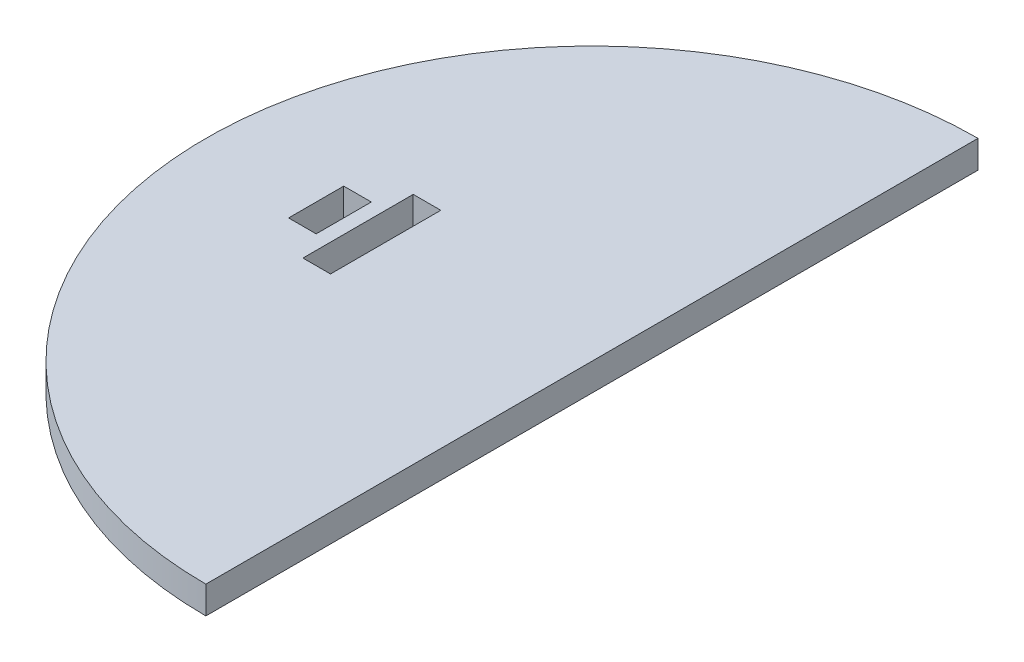
ISO-10303-21;
HEADER;
FILE_DESCRIPTION(('STEP AP214'),'2;1');
FILE_NAME('part.step','',(''),(''),'','','');
FILE_SCHEMA(('AUTOMOTIVE_DESIGN { 1 0 10303 214 1 1 1 1 }'));
ENDSEC;
DATA;
#1=APPLICATION_CONTEXT('core data for automotive mechanical design processes');
#2=APPLICATION_PROTOCOL_DEFINITION('international standard','automotive_design',2000,#1);
#3=PRODUCT_CONTEXT('',#1,'mechanical');
#4=PRODUCT('Part','Part','',(#3));
#5=PRODUCT_RELATED_PRODUCT_CATEGORY('part','',(#4));
#6=PRODUCT_DEFINITION_FORMATION('','',#4);
#7=PRODUCT_DEFINITION_CONTEXT('part definition',#1,'design');
#8=PRODUCT_DEFINITION('design','',#6,#7);
#9=PRODUCT_DEFINITION_SHAPE('','',#8);
#10=(LENGTH_UNIT() NAMED_UNIT(*) SI_UNIT(.MILLI.,.METRE.));
#11=(NAMED_UNIT(*) PLANE_ANGLE_UNIT() SI_UNIT($,.RADIAN.));
#12=(NAMED_UNIT(*) SI_UNIT($,.STERADIAN.) SOLID_ANGLE_UNIT());
#13=UNCERTAINTY_MEASURE_WITH_UNIT(LENGTH_MEASURE(1.E-05),#10,'distance_accuracy_value','');
#14=(GEOMETRIC_REPRESENTATION_CONTEXT(3) GLOBAL_UNCERTAINTY_ASSIGNED_CONTEXT((#13)) GLOBAL_UNIT_ASSIGNED_CONTEXT((#10,
#11,#12)) REPRESENTATION_CONTEXT('',''));
#15=CARTESIAN_POINT('',(0.,0.,0.));
#16=DIRECTION('',(0.,0.,1.));
#17=DIRECTION('',(1.,0.,0.));
#18=AXIS2_PLACEMENT_3D('',#15,#16,#17);
#19=CARTESIAN_POINT('',(0.,5.,0.));
#20=DIRECTION('',(0.,1.,0.));
#21=DIRECTION('',(0.,0.,1.));
#22=AXIS2_PLACEMENT_3D('',#19,#20,#21);
#23=PLANE('',#22);
#24=DIRECTION('',(1.,0.,0.));
#25=VECTOR('',#24,1.);
#26=CARTESIAN_POINT('',(-50.0000000000005,5.,-5.));
#27=LINE('',#26,#25);
#28=CARTESIAN_POINT('',(-50.0000000000005,5.,-5.));
#29=VERTEX_POINT('',#28);
#30=CARTESIAN_POINT('',(-45.0000000000005,5.,-5.));
#31=VERTEX_POINT('',#30);
#32=EDGE_CURVE('E154',#29,#31,#27,.T.);
#33=ORIENTED_EDGE('',*,*,#32,.T.);
#34=DIRECTION('',(0.,0.,-1.));
#35=VECTOR('',#34,1.);
#36=CARTESIAN_POINT('',(-45.0000000000005,5.,5.));
#37=LINE('',#36,#35);
#38=CARTESIAN_POINT('',(-45.0000000000005,5.,5.));
#39=VERTEX_POINT('',#38);
#40=EDGE_CURVE('E157',#39,#31,#37,.T.);
#41=ORIENTED_EDGE('',*,*,#40,.F.);
#42=DIRECTION('',(1.,0.,0.));
#43=VECTOR('',#42,1.);
#44=CARTESIAN_POINT('',(-50.0000000000005,5.,5.));
#45=LINE('',#44,#43);
#46=CARTESIAN_POINT('',(-50.0000000000005,5.,5.));
#47=VERTEX_POINT('',#46);
#48=EDGE_CURVE('E160',#47,#39,#45,.T.);
#49=ORIENTED_EDGE('',*,*,#48,.F.);
#50=DIRECTION('',(0.,0.,-1.));
#51=VECTOR('',#50,1.);
#52=CARTESIAN_POINT('',(-50.0000000000005,5.,5.));
#53=LINE('',#52,#51);
#54=EDGE_CURVE('E163',#47,#29,#53,.T.);
#55=ORIENTED_EDGE('',*,*,#54,.T.);
#56=EDGE_LOOP('',(#33,#41,#49,#55));
#57=FACE_BOUND('',#56,.T.);
#58=DIRECTION('',(0.,0.,1.));
#59=VECTOR('',#58,1.);
#60=CARTESIAN_POINT('',(-5.11743425413158E-13,5.,-70.));
#61=LINE('',#60,#59);
#62=CARTESIAN_POINT('',(-4.88807387438039E-13,5.,-70.));
#63=VERTEX_POINT('',#62);
#64=CARTESIAN_POINT('',(0.,5.,70.));
#65=VERTEX_POINT('',#64);
#66=EDGE_CURVE('E185',#63,#65,#61,.T.);
#67=ORIENTED_EDGE('',*,*,#66,.F.);
#68=CARTESIAN_POINT('',(0.,5.,0.));
#69=DIRECTION('',(0.,1.,0.));
#70=DIRECTION('',(0.,0.,1.));
#71=AXIS2_PLACEMENT_3D('',#68,#69,#70);
#72=CIRCLE('',#71,70.);
#73=EDGE_CURVE('E188',#63,#65,#72,.T.);
#74=ORIENTED_EDGE('',*,*,#73,.T.);
#75=EDGE_LOOP('',(#67,#74));
#76=FACE_BOUND('',#75,.T.);
#77=DIRECTION('',(1.,0.,0.));
#78=VECTOR('',#77,1.);
#79=CARTESIAN_POINT('',(-42.4,5.,-9.99999999999999));
#80=LINE('',#79,#78);
#81=CARTESIAN_POINT('',(-42.4,5.,-9.99999999999999));
#82=VERTEX_POINT('',#81);
#83=CARTESIAN_POINT('',(-37.4,5.,-9.99999999999999));
#84=VERTEX_POINT('',#83);
#85=EDGE_CURVE('E145',#82,#84,#80,.T.);
#86=ORIENTED_EDGE('',*,*,#85,.T.);
#87=DIRECTION('',(0.,0.,1.));
#88=VECTOR('',#87,1.);
#89=CARTESIAN_POINT('',(-37.4,5.,0.));
#90=LINE('',#89,#88);
#91=CARTESIAN_POINT('',(-37.4,5.,10.));
#92=VERTEX_POINT('',#91);
#93=EDGE_CURVE('E66',#84,#92,#90,.T.);
#94=ORIENTED_EDGE('',*,*,#93,.T.);
#95=DIRECTION('',(-1.,0.,0.));
#96=VECTOR('',#95,1.);
#97=CARTESIAN_POINT('',(-37.4,5.,10.));
#98=LINE('',#97,#96);
#99=CARTESIAN_POINT('',(-42.4,5.,10.));
#100=VERTEX_POINT('',#99);
#101=EDGE_CURVE('E136',#92,#100,#98,.T.);
#102=ORIENTED_EDGE('',*,*,#101,.T.);
#103=DIRECTION('',(0.,0.,-1.));
#104=VECTOR('',#103,1.);
#105=CARTESIAN_POINT('',(-42.4,5.,10.));
#106=LINE('',#105,#104);
#107=EDGE_CURVE('E142',#100,#82,#106,.T.);
#108=ORIENTED_EDGE('',*,*,#107,.T.);
#109=EDGE_LOOP('',(#86,#94,#102,#108));
#110=FACE_BOUND('',#109,.T.);
#111=ADVANCED_FACE('F51',(#57,#76,#110),#23,.T.);
#112=CARTESIAN_POINT('',(0.,0.,0.));
#113=DIRECTION('',(0.,1.,0.));
#114=DIRECTION('',(0.,0.,1.));
#115=AXIS2_PLACEMENT_3D('',#112,#113,#114);
#116=PLANE('',#115);
#117=DIRECTION('',(0.,0.,1.));
#118=VECTOR('',#117,1.);
#119=CARTESIAN_POINT('',(-5.11743425413158E-13,0.,-70.));
#120=LINE('',#119,#118);
#121=CARTESIAN_POINT('',(-4.88807387438039E-13,0.,-70.));
#122=VERTEX_POINT('',#121);
#123=CARTESIAN_POINT('',(0.,0.,70.));
#124=VERTEX_POINT('',#123);
#125=EDGE_CURVE('E178',#122,#124,#120,.T.);
#126=ORIENTED_EDGE('',*,*,#125,.T.);
#127=CARTESIAN_POINT('',(0.,0.,0.));
#128=DIRECTION('',(0.,1.,0.));
#129=DIRECTION('',(0.,0.,1.));
#130=AXIS2_PLACEMENT_3D('',#127,#128,#129);
#131=CIRCLE('',#130,70.);
#132=EDGE_CURVE('E189',#122,#124,#131,.T.);
#133=ORIENTED_EDGE('',*,*,#132,.F.);
#134=EDGE_LOOP('',(#126,#133));
#135=FACE_BOUND('',#134,.T.);
#136=DIRECTION('',(0.,0.,-1.));
#137=VECTOR('',#136,1.);
#138=CARTESIAN_POINT('',(-45.0000000000005,0.,5.));
#139=LINE('',#138,#137);
#140=CARTESIAN_POINT('',(-45.0000000000005,0.,5.));
#141=VERTEX_POINT('',#140);
#142=CARTESIAN_POINT('',(-45.0000000000005,0.,-5.));
#143=VERTEX_POINT('',#142);
#144=EDGE_CURVE('E168',#141,#143,#139,.T.);
#145=ORIENTED_EDGE('',*,*,#144,.T.);
#146=DIRECTION('',(1.,0.,0.));
#147=VECTOR('',#146,1.);
#148=CARTESIAN_POINT('',(-50.0000000000005,0.,-5.));
#149=LINE('',#148,#147);
#150=CARTESIAN_POINT('',(-50.0000000000005,0.,-5.));
#151=VERTEX_POINT('',#150);
#152=EDGE_CURVE('E132',#151,#143,#149,.T.);
#153=ORIENTED_EDGE('',*,*,#152,.F.);
#154=DIRECTION('',(0.,0.,-1.));
#155=VECTOR('',#154,1.);
#156=CARTESIAN_POINT('',(-50.0000000000005,0.,5.));
#157=LINE('',#156,#155);
#158=CARTESIAN_POINT('',(-50.0000000000005,0.,5.));
#159=VERTEX_POINT('',#158);
#160=EDGE_CURVE('E158',#159,#151,#157,.T.);
#161=ORIENTED_EDGE('',*,*,#160,.F.);
#162=DIRECTION('',(1.,0.,0.));
#163=VECTOR('',#162,1.);
#164=CARTESIAN_POINT('',(-50.0000000000005,0.,5.));
#165=LINE('',#164,#163);
#166=EDGE_CURVE('E171',#159,#141,#165,.T.);
#167=ORIENTED_EDGE('',*,*,#166,.T.);
#168=EDGE_LOOP('',(#145,#153,#161,#167));
#169=FACE_BOUND('',#168,.T.);
#170=DIRECTION('',(0.,0.,1.));
#171=VECTOR('',#170,1.);
#172=CARTESIAN_POINT('',(-37.4,0.,0.));
#173=LINE('',#172,#171);
#174=CARTESIAN_POINT('',(-37.4,0.,-9.99999999999999));
#175=VERTEX_POINT('',#174);
#176=CARTESIAN_POINT('',(-37.4,0.,10.));
#177=VERTEX_POINT('',#176);
#178=EDGE_CURVE('E12',#175,#177,#173,.T.);
#179=ORIENTED_EDGE('',*,*,#178,.F.);
#180=DIRECTION('',(1.,0.,0.));
#181=VECTOR('',#180,1.);
#182=CARTESIAN_POINT('',(0.,0.,-9.99999999999999));
#183=LINE('',#182,#181);
#184=CARTESIAN_POINT('',(-42.4,0.,-9.99999999999999));
#185=VERTEX_POINT('',#184);
#186=EDGE_CURVE('E198',#185,#175,#183,.T.);
#187=ORIENTED_EDGE('',*,*,#186,.F.);
#188=DIRECTION('',(0.,0.,-1.));
#189=VECTOR('',#188,1.);
#190=CARTESIAN_POINT('',(-42.4,0.,0.));
#191=LINE('',#190,#189);
#192=CARTESIAN_POINT('',(-42.4,0.,10.));
#193=VERTEX_POINT('',#192);
#194=EDGE_CURVE('E201',#193,#185,#191,.T.);
#195=ORIENTED_EDGE('',*,*,#194,.F.);
#196=DIRECTION('',(-1.,0.,0.));
#197=VECTOR('',#196,1.);
#198=CARTESIAN_POINT('',(0.,0.,9.99999999999998));
#199=LINE('',#198,#197);
#200=EDGE_CURVE('E59',#177,#193,#199,.T.);
#201=ORIENTED_EDGE('',*,*,#200,.F.);
#202=EDGE_LOOP('',(#179,#187,#195,#201));
#203=FACE_BOUND('',#202,.T.);
#204=ADVANCED_FACE('F207',(#135,#169,#203),#116,.F.);
#205=CARTESIAN_POINT('',(-5.11743425413158E-13,5.,-70.));
#206=DIRECTION('',(1.,0.,0.));
#207=DIRECTION('',(0.,0.,-1.));
#208=AXIS2_PLACEMENT_3D('',#205,#206,#207);
#209=PLANE('',#208);
#210=ORIENTED_EDGE('',*,*,#125,.F.);
#211=DIRECTION('',(0.,-1.,0.));
#212=VECTOR('',#211,1.);
#213=CARTESIAN_POINT('',(-4.88807387438039E-13,5.,-70.));
#214=LINE('',#213,#212);
#215=EDGE_CURVE('E196',#63,#122,#214,.T.);
#216=ORIENTED_EDGE('',*,*,#215,.F.);
#217=ORIENTED_EDGE('',*,*,#66,.T.);
#218=DIRECTION('',(0.,-1.,0.));
#219=VECTOR('',#218,1.);
#220=CARTESIAN_POINT('',(0.,5.,70.));
#221=LINE('',#220,#219);
#222=EDGE_CURVE('E191',#65,#124,#221,.T.);
#223=ORIENTED_EDGE('',*,*,#222,.T.);
#224=EDGE_LOOP('',(#210,#216,#217,#223));
#225=FACE_BOUND('',#224,.T.);
#226=ADVANCED_FACE('F53',(#225),#209,.T.);
#227=CARTESIAN_POINT('',(0.,5.,0.));
#228=DIRECTION('',(0.,-1.,0.));
#229=DIRECTION('',(0.,0.,-1.));
#230=AXIS2_PLACEMENT_3D('',#227,#228,#229);
#231=CYLINDRICAL_SURFACE('',#230,70.);
#232=ORIENTED_EDGE('',*,*,#132,.T.);
#233=ORIENTED_EDGE('',*,*,#222,.F.);
#234=ORIENTED_EDGE('',*,*,#73,.F.);
#235=ORIENTED_EDGE('',*,*,#215,.T.);
#236=EDGE_LOOP('',(#232,#233,#234,#235));
#237=FACE_BOUND('',#236,.T.);
#238=ADVANCED_FACE('F227',(#237),#231,.T.);
#239=CARTESIAN_POINT('',(-50.0000000000005,5.,-5.));
#240=DIRECTION('',(0.,0.,-1.));
#241=DIRECTION('',(-1.,0.,0.));
#242=AXIS2_PLACEMENT_3D('',#239,#240,#241);
#243=PLANE('',#242);
#244=ORIENTED_EDGE('',*,*,#152,.T.);
#245=DIRECTION('',(0.,-1.,0.));
#246=VECTOR('',#245,1.);
#247=CARTESIAN_POINT('',(-45.0000000000005,5.,-5.));
#248=LINE('',#247,#246);
#249=EDGE_CURVE('E166',#31,#143,#248,.T.);
#250=ORIENTED_EDGE('',*,*,#249,.F.);
#251=ORIENTED_EDGE('',*,*,#32,.F.);
#252=DIRECTION('',(0.,-1.,0.));
#253=VECTOR('',#252,1.);
#254=CARTESIAN_POINT('',(-50.0000000000005,5.,-5.));
#255=LINE('',#254,#253);
#256=EDGE_CURVE('E176',#29,#151,#255,.T.);
#257=ORIENTED_EDGE('',*,*,#256,.T.);
#258=EDGE_LOOP('',(#244,#250,#251,#257));
#259=FACE_BOUND('',#258,.T.);
#260=ADVANCED_FACE('F225',(#259),#243,.F.);
#261=CARTESIAN_POINT('',(-50.0000000000005,5.,5.));
#262=DIRECTION('',(-1.,0.,0.));
#263=DIRECTION('',(0.,0.,1.));
#264=AXIS2_PLACEMENT_3D('',#261,#262,#263);
#265=PLANE('',#264);
#266=ORIENTED_EDGE('',*,*,#160,.T.);
#267=ORIENTED_EDGE('',*,*,#256,.F.);
#268=ORIENTED_EDGE('',*,*,#54,.F.);
#269=DIRECTION('',(0.,-1.,0.));
#270=VECTOR('',#269,1.);
#271=CARTESIAN_POINT('',(-50.0000000000005,5.,5.));
#272=LINE('',#271,#270);
#273=EDGE_CURVE('E179',#47,#159,#272,.T.);
#274=ORIENTED_EDGE('',*,*,#273,.T.);
#275=EDGE_LOOP('',(#266,#267,#268,#274));
#276=FACE_BOUND('',#275,.T.);
#277=ADVANCED_FACE('F234',(#276),#265,.F.);
#278=CARTESIAN_POINT('',(-50.0000000000005,5.,5.));
#279=DIRECTION('',(0.,0.,-1.));
#280=DIRECTION('',(-1.,0.,0.));
#281=AXIS2_PLACEMENT_3D('',#278,#279,#280);
#282=PLANE('',#281);
#283=ORIENTED_EDGE('',*,*,#166,.F.);
#284=ORIENTED_EDGE('',*,*,#273,.F.);
#285=ORIENTED_EDGE('',*,*,#48,.T.);
#286=DIRECTION('',(0.,-1.,0.));
#287=VECTOR('',#286,1.);
#288=CARTESIAN_POINT('',(-45.0000000000005,5.,5.));
#289=LINE('',#288,#287);
#290=EDGE_CURVE('E181',#39,#141,#289,.T.);
#291=ORIENTED_EDGE('',*,*,#290,.T.);
#292=EDGE_LOOP('',(#283,#284,#285,#291));
#293=FACE_BOUND('',#292,.T.);
#294=ADVANCED_FACE('F256',(#293),#282,.T.);
#295=CARTESIAN_POINT('',(-45.0000000000005,5.,5.));
#296=DIRECTION('',(-1.,0.,0.));
#297=DIRECTION('',(0.,0.,1.));
#298=AXIS2_PLACEMENT_3D('',#295,#296,#297);
#299=PLANE('',#298);
#300=ORIENTED_EDGE('',*,*,#144,.F.);
#301=ORIENTED_EDGE('',*,*,#290,.F.);
#302=ORIENTED_EDGE('',*,*,#40,.T.);
#303=ORIENTED_EDGE('',*,*,#249,.T.);
#304=EDGE_LOOP('',(#300,#301,#302,#303));
#305=FACE_BOUND('',#304,.T.);
#306=ADVANCED_FACE('F248',(#305),#299,.T.);
#307=CARTESIAN_POINT('',(-37.4,-5.,0.));
#308=DIRECTION('',(-1.,0.,0.));
#309=DIRECTION('',(0.,0.,1.));
#310=AXIS2_PLACEMENT_3D('',#307,#308,#309);
#311=PLANE('',#310);
#312=ORIENTED_EDGE('',*,*,#178,.T.);
#313=DIRECTION('',(0.,1.,0.));
#314=VECTOR('',#313,1.);
#315=CARTESIAN_POINT('',(-37.4,-5.,10.));
#316=LINE('',#315,#314);
#317=EDGE_CURVE('E126',#177,#92,#316,.T.);
#318=ORIENTED_EDGE('',*,*,#317,.T.);
#319=ORIENTED_EDGE('',*,*,#93,.F.);
#320=DIRECTION('',(0.,1.,0.));
#321=VECTOR('',#320,1.);
#322=CARTESIAN_POINT('',(-37.4,-5.,-9.99999999999999));
#323=LINE('',#322,#321);
#324=EDGE_CURVE('E150',#175,#84,#323,.T.);
#325=ORIENTED_EDGE('',*,*,#324,.F.);
#326=EDGE_LOOP('',(#312,#318,#319,#325));
#327=FACE_BOUND('',#326,.T.);
#328=ADVANCED_FACE('F128',(#327),#311,.T.);
#329=CARTESIAN_POINT('',(-37.4,-5.,10.));
#330=DIRECTION('',(0.,0.,-1.));
#331=DIRECTION('',(-1.,0.,0.));
#332=AXIS2_PLACEMENT_3D('',#329,#330,#331);
#333=PLANE('',#332);
#334=ORIENTED_EDGE('',*,*,#200,.T.);
#335=DIRECTION('',(0.,1.,0.));
#336=VECTOR('',#335,1.);
#337=CARTESIAN_POINT('',(-42.4,-5.,10.));
#338=LINE('',#337,#336);
#339=EDGE_CURVE('E133',#193,#100,#338,.T.);
#340=ORIENTED_EDGE('',*,*,#339,.T.);
#341=ORIENTED_EDGE('',*,*,#101,.F.);
#342=ORIENTED_EDGE('',*,*,#317,.F.);
#343=EDGE_LOOP('',(#334,#340,#341,#342));
#344=FACE_BOUND('',#343,.T.);
#345=ADVANCED_FACE('F137',(#344),#333,.T.);
#346=CARTESIAN_POINT('',(-42.4,-5.,10.));
#347=DIRECTION('',(1.,0.,0.));
#348=DIRECTION('',(0.,0.,-1.));
#349=AXIS2_PLACEMENT_3D('',#346,#347,#348);
#350=PLANE('',#349);
#351=ORIENTED_EDGE('',*,*,#194,.T.);
#352=DIRECTION('',(0.,1.,0.));
#353=VECTOR('',#352,1.);
#354=CARTESIAN_POINT('',(-42.4,-5.,-9.99999999999999));
#355=LINE('',#354,#353);
#356=EDGE_CURVE('E74',#185,#82,#355,.T.);
#357=ORIENTED_EDGE('',*,*,#356,.T.);
#358=ORIENTED_EDGE('',*,*,#107,.F.);
#359=ORIENTED_EDGE('',*,*,#339,.F.);
#360=EDGE_LOOP('',(#351,#357,#358,#359));
#361=FACE_BOUND('',#360,.T.);
#362=ADVANCED_FACE('F205',(#361),#350,.T.);
#363=CARTESIAN_POINT('',(-42.4,-5.,-9.99999999999999));
#364=DIRECTION('',(0.,0.,1.));
#365=DIRECTION('',(1.,0.,0.));
#366=AXIS2_PLACEMENT_3D('',#363,#364,#365);
#367=PLANE('',#366);
#368=ORIENTED_EDGE('',*,*,#186,.T.);
#369=ORIENTED_EDGE('',*,*,#324,.T.);
#370=ORIENTED_EDGE('',*,*,#85,.F.);
#371=ORIENTED_EDGE('',*,*,#356,.F.);
#372=EDGE_LOOP('',(#368,#369,#370,#371));
#373=FACE_BOUND('',#372,.T.);
#374=ADVANCED_FACE('F208',(#373),#367,.T.);
#375=CLOSED_SHELL('',(#111,#204,#226,#238,#260,#277,#294,#306,#328,#345,#362,#374));
#376=MANIFOLD_SOLID_BREP('B2',#375);
#377=ADVANCED_BREP_SHAPE_REPRESENTATION('',(#18,#376),#14);
#378=SHAPE_DEFINITION_REPRESENTATION(#9,#377);
ENDSEC;
END-ISO-10303-21;
